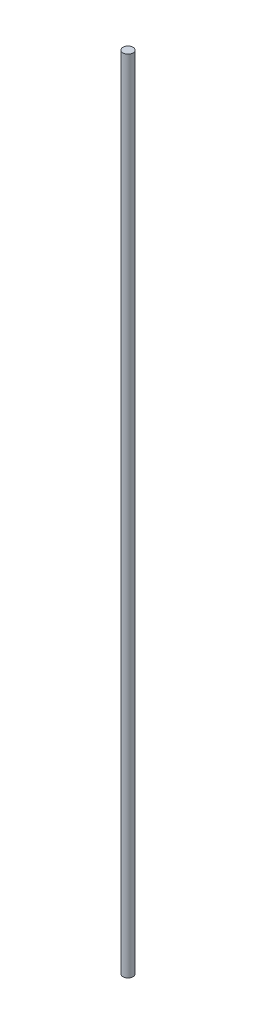
ISO-10303-21;
HEADER;
FILE_DESCRIPTION(('STEP AP214'),'2;1');
FILE_NAME('part.step','',(''),(''),'','','');
FILE_SCHEMA(('AUTOMOTIVE_DESIGN { 1 0 10303 214 1 1 1 1 }'));
ENDSEC;
DATA;
#1=APPLICATION_CONTEXT('core data for automotive mechanical design processes');
#2=APPLICATION_PROTOCOL_DEFINITION('international standard','automotive_design',2000,#1);
#3=PRODUCT_CONTEXT('',#1,'mechanical');
#4=PRODUCT('Part','Part','',(#3));
#5=PRODUCT_RELATED_PRODUCT_CATEGORY('part','',(#4));
#6=PRODUCT_DEFINITION_FORMATION('','',#4);
#7=PRODUCT_DEFINITION_CONTEXT('part definition',#1,'design');
#8=PRODUCT_DEFINITION('design','',#6,#7);
#9=PRODUCT_DEFINITION_SHAPE('','',#8);
#10=(LENGTH_UNIT() NAMED_UNIT(*) SI_UNIT(.MILLI.,.METRE.));
#11=(NAMED_UNIT(*) PLANE_ANGLE_UNIT() SI_UNIT($,.RADIAN.));
#12=(NAMED_UNIT(*) SI_UNIT($,.STERADIAN.) SOLID_ANGLE_UNIT());
#13=UNCERTAINTY_MEASURE_WITH_UNIT(LENGTH_MEASURE(1.E-05),#10,'distance_accuracy_value','');
#14=(GEOMETRIC_REPRESENTATION_CONTEXT(3) GLOBAL_UNCERTAINTY_ASSIGNED_CONTEXT((#13)) GLOBAL_UNIT_ASSIGNED_CONTEXT((#10,
#11,#12)) REPRESENTATION_CONTEXT('',''));
#15=CARTESIAN_POINT('',(0.,0.,0.));
#16=DIRECTION('',(0.,0.,1.));
#17=DIRECTION('',(1.,0.,0.));
#18=AXIS2_PLACEMENT_3D('',#15,#16,#17);
#19=CARTESIAN_POINT('',(0.,80.,0.));
#20=DIRECTION('',(0.,-1.,0.));
#21=DIRECTION('',(0.,0.,-1.));
#22=AXIS2_PLACEMENT_3D('',#19,#20,#21);
#23=CYLINDRICAL_SURFACE('',#22,0.5);
#24=CARTESIAN_POINT('',(0.,80.,0.));
#25=DIRECTION('',(0.,1.,0.));
#26=DIRECTION('',(0.,0.,1.));
#27=AXIS2_PLACEMENT_3D('',#24,#25,#26);
#28=CIRCLE('',#27,0.5);
#29=CARTESIAN_POINT('',(0.,80.,0.5));
#30=VERTEX_POINT('',#29);
#31=EDGE_CURVE('E10',#30,#30,#28,.T.);
#32=ORIENTED_EDGE('',*,*,#31,.F.);
#33=EDGE_LOOP('',(#32));
#34=FACE_BOUND('',#33,.T.);
#35=CARTESIAN_POINT('',(0.,0.,0.));
#36=DIRECTION('',(0.,1.,0.));
#37=DIRECTION('',(0.,0.,1.));
#38=AXIS2_PLACEMENT_3D('',#35,#36,#37);
#39=CIRCLE('',#38,0.5);
#40=CARTESIAN_POINT('',(0.,0.,0.5));
#41=VERTEX_POINT('',#40);
#42=EDGE_CURVE('E40',#41,#41,#39,.T.);
#43=ORIENTED_EDGE('',*,*,#42,.T.);
#44=EDGE_LOOP('',(#43));
#45=FACE_BOUND('',#44,.T.);
#46=ADVANCED_FACE('F37',(#34,#45),#23,.T.);
#47=CARTESIAN_POINT('',(0.,80.,0.));
#48=DIRECTION('',(0.,1.,0.));
#49=DIRECTION('',(0.,0.,1.));
#50=AXIS2_PLACEMENT_3D('',#47,#48,#49);
#51=PLANE('',#50);
#52=ORIENTED_EDGE('',*,*,#31,.T.);
#53=EDGE_LOOP('',(#52));
#54=FACE_BOUND('',#53,.T.);
#55=ADVANCED_FACE('F52',(#54),#51,.T.);
#56=CARTESIAN_POINT('',(0.,0.,0.));
#57=DIRECTION('',(0.,1.,0.));
#58=DIRECTION('',(0.,0.,1.));
#59=AXIS2_PLACEMENT_3D('',#56,#57,#58);
#60=PLANE('',#59);
#61=ORIENTED_EDGE('',*,*,#42,.F.);
#62=EDGE_LOOP('',(#61));
#63=FACE_BOUND('',#62,.T.);
#64=ADVANCED_FACE('F50',(#63),#60,.F.);
#65=CLOSED_SHELL('',(#46,#55,#64));
#66=MANIFOLD_SOLID_BREP('B2',#65);
#67=ADVANCED_BREP_SHAPE_REPRESENTATION('',(#18,#66),#14);
#68=SHAPE_DEFINITION_REPRESENTATION(#9,#67);
ENDSEC;
END-ISO-10303-21;
